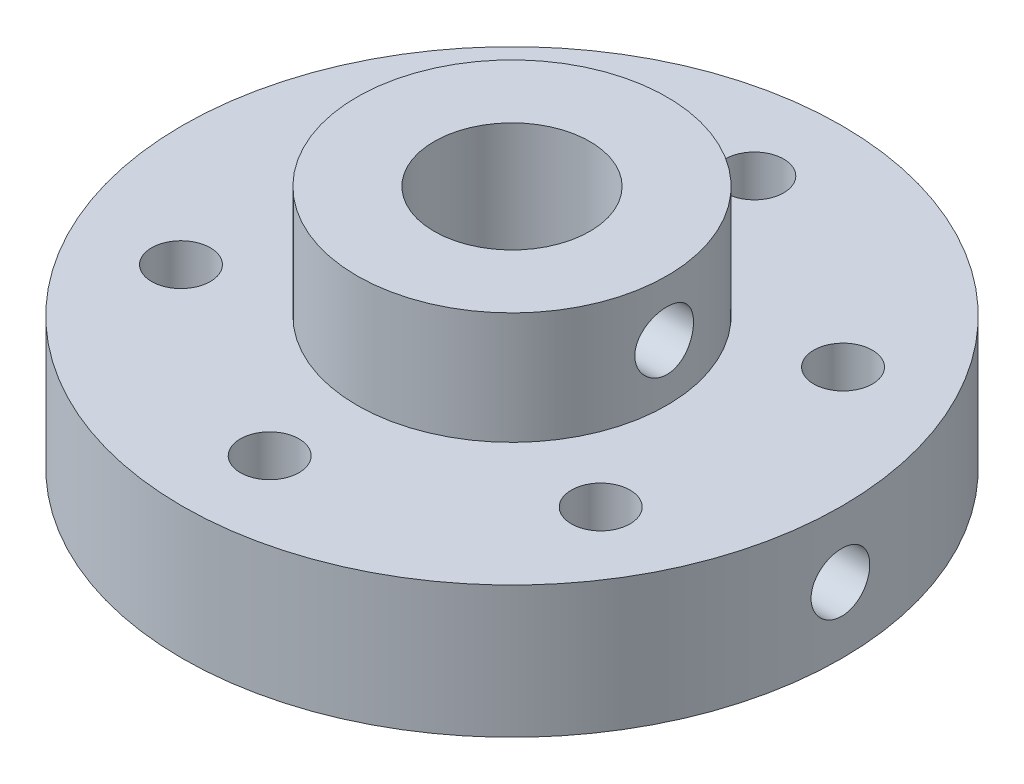
ISO-10303-21;
HEADER;
FILE_DESCRIPTION(('STEP AP214'),'2;1');
FILE_NAME('part.step','',(''),(''),'','','');
FILE_SCHEMA(('AUTOMOTIVE_DESIGN { 1 0 10303 214 1 1 1 1 }'));
ENDSEC;
DATA;
#1=APPLICATION_CONTEXT('core data for automotive mechanical design processes');
#2=APPLICATION_PROTOCOL_DEFINITION('international standard','automotive_design',2000,#1);
#3=PRODUCT_CONTEXT('',#1,'mechanical');
#4=PRODUCT('Part','Part','',(#3));
#5=PRODUCT_RELATED_PRODUCT_CATEGORY('part','',(#4));
#6=PRODUCT_DEFINITION_FORMATION('','',#4);
#7=PRODUCT_DEFINITION_CONTEXT('part definition',#1,'design');
#8=PRODUCT_DEFINITION('design','',#6,#7);
#9=PRODUCT_DEFINITION_SHAPE('','',#8);
#10=(LENGTH_UNIT() NAMED_UNIT(*) SI_UNIT(.MILLI.,.METRE.));
#11=(NAMED_UNIT(*) PLANE_ANGLE_UNIT() SI_UNIT($,.RADIAN.));
#12=(NAMED_UNIT(*) SI_UNIT($,.STERADIAN.) SOLID_ANGLE_UNIT());
#13=UNCERTAINTY_MEASURE_WITH_UNIT(LENGTH_MEASURE(1.E-05),#10,'distance_accuracy_value','');
#14=(GEOMETRIC_REPRESENTATION_CONTEXT(3) GLOBAL_UNCERTAINTY_ASSIGNED_CONTEXT((#13)) GLOBAL_UNIT_ASSIGNED_CONTEXT((#10,
#11,#12)) REPRESENTATION_CONTEXT('',''));
#15=CARTESIAN_POINT('',(0.,0.,0.));
#16=DIRECTION('',(0.,0.,1.));
#17=DIRECTION('',(1.,0.,0.));
#18=AXIS2_PLACEMENT_3D('',#15,#16,#17);
#19=CARTESIAN_POINT('',(0.,5.08,0.));
#20=DIRECTION('',(0.,1.,0.));
#21=DIRECTION('',(0.,0.,1.));
#22=AXIS2_PLACEMENT_3D('',#19,#20,#21);
#23=PLANE('',#22);
#24=CARTESIAN_POINT('',(8.08391413162611,5.08,-4.66724999999953));
#25=DIRECTION('',(0.,1.,0.));
#26=DIRECTION('',(0.,0.,1.));
#27=AXIS2_PLACEMENT_3D('',#24,#25,#26);
#28=CIRCLE('',#27,1.13029999999999);
#29=CARTESIAN_POINT('',(8.08391413162611,5.08,-3.53694999999954));
#30=VERTEX_POINT('',#29);
#31=EDGE_CURVE('E79',#30,#30,#28,.T.);
#32=ORIENTED_EDGE('',*,*,#31,.F.);
#33=EDGE_LOOP('',(#32));
#34=FACE_BOUND('',#33,.T.);
#35=CARTESIAN_POINT('',(8.08391413162562,5.08,4.66725000000038));
#36=DIRECTION('',(0.,1.,0.));
#37=DIRECTION('',(0.,0.,1.));
#38=AXIS2_PLACEMENT_3D('',#35,#36,#37);
#39=CIRCLE('',#38,1.13029999999999);
#40=CARTESIAN_POINT('',(8.08391413162562,5.08,5.79755000000036));
#41=VERTEX_POINT('',#40);
#42=EDGE_CURVE('E87',#41,#41,#39,.T.);
#43=ORIENTED_EDGE('',*,*,#42,.F.);
#44=EDGE_LOOP('',(#43));
#45=FACE_BOUND('',#44,.T.);
#46=CARTESIAN_POINT('',(0.,5.08,9.3345));
#47=DIRECTION('',(0.,1.,0.));
#48=DIRECTION('',(0.,0.,1.));
#49=AXIS2_PLACEMENT_3D('',#46,#47,#48);
#50=CIRCLE('',#49,1.13029999999999);
#51=CARTESIAN_POINT('',(0.,5.08,10.4648));
#52=VERTEX_POINT('',#51);
#53=EDGE_CURVE('E93',#52,#52,#50,.T.);
#54=ORIENTED_EDGE('',*,*,#53,.F.);
#55=EDGE_LOOP('',(#54));
#56=FACE_BOUND('',#55,.T.);
#57=CARTESIAN_POINT('',(-8.08391413162595,5.08,4.66724999999981));
#58=DIRECTION('',(0.,1.,0.));
#59=DIRECTION('',(0.,0.,1.));
#60=AXIS2_PLACEMENT_3D('',#57,#58,#59);
#61=CIRCLE('',#60,1.13029999999999);
#62=CARTESIAN_POINT('',(-8.08391413162595,5.08,5.7975499999998));
#63=VERTEX_POINT('',#62);
#64=EDGE_CURVE('E99',#63,#63,#61,.T.);
#65=ORIENTED_EDGE('',*,*,#64,.F.);
#66=EDGE_LOOP('',(#65));
#67=FACE_BOUND('',#66,.T.);
#68=CARTESIAN_POINT('',(-8.08391413162579,5.08,-4.66725000000009));
#69=DIRECTION('',(0.,1.,0.));
#70=DIRECTION('',(0.,0.,1.));
#71=AXIS2_PLACEMENT_3D('',#68,#69,#70);
#72=CIRCLE('',#71,1.13029999999999);
#73=CARTESIAN_POINT('',(-8.08391413162579,5.08,-3.53695000000011));
#74=VERTEX_POINT('',#73);
#75=EDGE_CURVE('E105',#74,#74,#72,.T.);
#76=ORIENTED_EDGE('',*,*,#75,.F.);
#77=EDGE_LOOP('',(#76));
#78=FACE_BOUND('',#77,.T.);
#79=CARTESIAN_POINT('',(0.,5.08,-9.3345));
#80=DIRECTION('',(0.,1.,0.));
#81=DIRECTION('',(0.,0.,1.));
#82=AXIS2_PLACEMENT_3D('',#79,#80,#81);
#83=CIRCLE('',#82,1.13029999999999);
#84=CARTESIAN_POINT('',(0.,5.08,-8.20420000000001));
#85=VERTEX_POINT('',#84);
#86=EDGE_CURVE('E111',#85,#85,#83,.T.);
#87=ORIENTED_EDGE('',*,*,#86,.F.);
#88=EDGE_LOOP('',(#87));
#89=FACE_BOUND('',#88,.T.);
#90=CARTESIAN_POINT('',(0.,5.08,0.));
#91=DIRECTION('',(0.,1.,0.));
#92=DIRECTION('',(0.,0.,1.));
#93=AXIS2_PLACEMENT_3D('',#90,#91,#92);
#94=CIRCLE('',#93,12.7);
#95=CARTESIAN_POINT('',(0.,5.08,12.7));
#96=VERTEX_POINT('',#95);
#97=EDGE_CURVE('E44',#96,#96,#94,.T.);
#98=ORIENTED_EDGE('',*,*,#97,.T.);
#99=EDGE_LOOP('',(#98));
#100=FACE_BOUND('',#99,.T.);
#101=CARTESIAN_POINT('',(0.,5.08,0.));
#102=DIRECTION('',(0.,1.,0.));
#103=DIRECTION('',(0.,0.,1.));
#104=AXIS2_PLACEMENT_3D('',#101,#102,#103);
#105=CIRCLE('',#104,5.969);
#106=CARTESIAN_POINT('',(0.,5.08,5.969));
#107=VERTEX_POINT('',#106);
#108=EDGE_CURVE('E117',#107,#107,#105,.T.);
#109=ORIENTED_EDGE('',*,*,#108,.F.);
#110=EDGE_LOOP('',(#109));
#111=FACE_BOUND('',#110,.T.);
#112=ADVANCED_FACE('F31',(#34,#45,#56,#67,#78,#89,#100,#111),#23,.T.);
#113=CARTESIAN_POINT('',(0.,5.08,0.));
#114=DIRECTION('',(0.,-1.,0.));
#115=DIRECTION('',(0.,0.,-1.));
#116=AXIS2_PLACEMENT_3D('',#113,#114,#115);
#117=CYLINDRICAL_SURFACE('',#116,12.7);
#118=CARTESIAN_POINT('',(12.7,1.40970000000001,0.));
#119=CARTESIAN_POINT('',(12.6999993442662,1.40970275996524,0.0633549662870578));
#120=CARTESIAN_POINT('',(12.6995208743728,1.41504463045691,0.126752665207346));
#121=CARTESIAN_POINT('',(12.6976581682521,1.43627511603167,0.251792843437398));
#122=CARTESIAN_POINT('',(12.6962729149133,1.4521755746525,0.313433270551566));
#123=CARTESIAN_POINT('',(12.6927531279238,1.49405879468067,0.433129919396754));
#124=CARTESIAN_POINT('',(12.6906190274599,1.52003572804752,0.491188190521169));
#125=CARTESIAN_POINT('',(12.68584065064,1.58132379024321,0.60210692242587));
#126=CARTESIAN_POINT('',(12.6831964809823,1.61663296748805,0.65496846679239));
#127=CARTESIAN_POINT('',(12.6776859812866,1.6956929641805,0.754159197131341));
#128=CARTESIAN_POINT('',(12.6748190997262,1.73946516761339,0.800471309893539));
#129=CARTESIAN_POINT('',(12.6691908973995,1.8341633345258,0.885101966605944));
#130=CARTESIAN_POINT('',(12.6664295813516,1.88508961729169,0.923420153597666));
#131=CARTESIAN_POINT('',(12.6613193372878,1.99275496911822,0.991034006795327));
#132=CARTESIAN_POINT('',(12.6589711052144,2.04950359752639,1.02031450821889));
#133=CARTESIAN_POINT('',(12.6549594154604,2.1671362454533,1.06892497046169));
#134=CARTESIAN_POINT('',(12.6532959441501,2.22802018263292,1.08825512933881));
#135=CARTESIAN_POINT('',(12.6508468875705,2.35202297237841,1.11636627626064));
#136=CARTESIAN_POINT('',(12.65005897243,2.4151354302412,1.12517526603385));
#137=CARTESIAN_POINT('',(12.6494429242787,2.54194763005314,1.13208054267278));
#138=CARTESIAN_POINT('',(12.6496147709531,2.60564735954326,1.13017705628481));
#139=CARTESIAN_POINT('',(12.6508967086965,2.73163364643223,1.11573453505945));
#140=CARTESIAN_POINT('',(12.6520041110958,2.79392372880229,1.10322597749987));
#141=CARTESIAN_POINT('',(12.6550281729631,2.91551680096642,1.06797575874834));
#142=CARTESIAN_POINT('',(12.6569448413074,2.97481975798859,1.04523398531445));
#143=CARTESIAN_POINT('',(12.661374570342,3.0888520409167,0.990128920983867));
#144=CARTESIAN_POINT('',(12.6638884745654,3.14357474850884,0.957752004966511));
#145=CARTESIAN_POINT('',(12.6692286657572,3.24682076504201,0.884305528900144));
#146=CARTESIAN_POINT('',(12.6720549599532,3.29534393049405,0.843235767712834));
#147=CARTESIAN_POINT('',(12.6777134478915,3.38499064342493,0.753398711268004));
#148=CARTESIAN_POINT('',(12.6805456278451,3.42608780111357,0.704605076649213));
#149=CARTESIAN_POINT('',(12.6858874119665,3.49951170078229,0.600797098391809));
#150=CARTESIAN_POINT('',(12.6883970158769,3.53183843575969,0.545782749786351));
#151=CARTESIAN_POINT('',(12.692811467624,3.58680239672926,0.431077483891174));
#152=CARTESIAN_POINT('',(12.6947162391092,3.60943839952807,0.371385977360789));
#153=CARTESIAN_POINT('',(12.6977055702252,3.64435959074977,0.249028930160306));
#154=CARTESIAN_POINT('',(12.698790149275,3.65664502423433,0.186363459939339));
#155=CARTESIAN_POINT('',(12.7000144007699,3.6704831265007,0.0600660041406285));
#156=CARTESIAN_POINT('',(12.7001572813243,3.6720722351296,-0.0035619590367424));
#157=CARTESIAN_POINT('',(12.6994906162937,3.66456811790858,-0.130179123062571));
#158=CARTESIAN_POINT('',(12.6986810808622,3.65547500593908,-0.193168330713417));
#159=CARTESIAN_POINT('',(12.6962026618106,3.62689477944628,-0.316615641736333));
#160=CARTESIAN_POINT('',(12.6945351793369,3.60742461024132,-0.377077698751924));
#161=CARTESIAN_POINT('',(12.6905281036814,3.55866029739495,-0.493877017716605));
#162=CARTESIAN_POINT('',(12.6881884984357,3.52936597741896,-0.550214205605931));
#163=CARTESIAN_POINT('',(12.6830912656799,3.46169373241325,-0.657330068574677));
#164=CARTESIAN_POINT('',(12.6803325372428,3.42329173027503,-0.708093479326384));
#165=CARTESIAN_POINT('',(12.6747105175415,3.33852891040848,-0.802466579915461));
#166=CARTESIAN_POINT('',(12.6718472242049,3.29216793488274,-0.846076127884289));
#167=CARTESIAN_POINT('',(12.6663292375558,3.19264477851914,-0.925029072785663));
#168=CARTESIAN_POINT('',(12.6636751596436,3.13946365961629,-0.960348646577449));
#169=CARTESIAN_POINT('',(12.6588850522987,3.0279038233009,-1.02155556833741));
#170=CARTESIAN_POINT('',(12.6567490170742,2.96952516400875,-1.0474430217618));
#171=CARTESIAN_POINT('',(12.6532404409206,2.8493109072017,-1.08901049476346));
#172=CARTESIAN_POINT('',(12.6518668193799,2.78748033987342,-1.10470496682232));
#173=CARTESIAN_POINT('',(12.6500350747212,2.66204883559887,-1.12548797292162));
#174=CARTESIAN_POINT('',(12.649576931264,2.59844793801565,-1.1305767425878));
#175=CARTESIAN_POINT('',(12.6496283581756,2.47151792687397,-1.13000099869347));
#176=CARTESIAN_POINT('',(12.6501345603107,2.40818863882937,-1.12437391313382));
#177=CARTESIAN_POINT('',(12.6520504780416,2.28337852391187,-1.10260437390431));
#178=CARTESIAN_POINT('',(12.6534601949107,2.2218976996441,-1.08646190541541));
#179=CARTESIAN_POINT('',(12.6570234016182,2.10252818113132,-1.04412958765887));
#180=CARTESIAN_POINT('',(12.6591768311197,2.04463919593201,-1.01794055344363));
#181=CARTESIAN_POINT('',(12.6639849385614,1.93407320902907,-0.956262575165948));
#182=CARTESIAN_POINT('',(12.6666396102607,1.88139614244489,-0.920773746892058));
#183=CARTESIAN_POINT('',(12.6721621485101,1.7825576054641,-0.841362858948852));
#184=CARTESIAN_POINT('',(12.6750306980048,1.73641850195347,-0.797413007717867));
#185=CARTESIAN_POINT('',(12.6806515272886,1.65215208116953,-0.702379940550796));
#186=CARTESIAN_POINT('',(12.6834037788713,1.61402669870939,-0.651295006881941));
#187=CARTESIAN_POINT('',(12.6884875727796,1.54681120811584,-0.543330140990367));
#188=CARTESIAN_POINT('',(12.6908182332511,1.51773994919049,-0.486438442445036));
#189=CARTESIAN_POINT('',(12.6947861884187,1.46960045235025,-0.368598504243941));
#190=CARTESIAN_POINT('',(12.6964242748527,1.45052078624174,-0.307654989327821));
#191=CARTESIAN_POINT('',(12.6984048358795,1.4277328905001,-0.205297080416445));
#192=CARTESIAN_POINT('',(12.6990002781437,1.42097962458262,-0.164539754289082));
#193=CARTESIAN_POINT('',(12.6997980731845,1.41196228730164,-0.0825276628943301));
#194=CARTESIAN_POINT('',(12.7000004271809,1.40969820200731,-0.0412728991709899));
#195=CARTESIAN_POINT('',(12.7,1.40970000000001,0.));
#196=B_SPLINE_CURVE_WITH_KNOTS('',3,(#118,#119,#120,#121,#122,#123,#124,#125,#126,#127,#128,
#129,#130,#131,#132,#133,#134,#135,#136,#137,#138,#139,#140,#141,#142,#143,#144,#145,#146,#147,
#148,#149,#150,#151,#152,#153,#154,#155,#156,#157,#158,#159,#160,#161,#162,#163,#164,#165,#166,
#167,#168,#169,#170,#171,#172,#173,#174,#175,#176,#177,#178,#179,#180,#181,#182,#183,#184,#185,
#186,#187,#188,#189,#190,#191,#192,#193,#194,#195),.UNSPECIFIED.,.T.,.F.,(4,2,2,2,2,2,2,2,2,2,2,
2,2,2,2,2,2,2,2,2,2,2,2,2,2,2,2,2,2,2,2,2,2,2,2,2,2,2,4),(0.,0.189914200719066,
0.380041788304177,0.570059573297018,0.760037652656218,0.950502185906145,1.14097522228554,
1.33176614687074,1.52255327368612,1.71283148752738,1.90310567384789,2.09283488891787,
2.28256618506335,2.47256706685702,2.66257234544273,2.85324010665162,3.0439080200977,
3.23459999313065,3.42528745118416,3.6153249519465,3.80536042678587,3.99508652784743,
4.18481603450222,4.37505281433224,4.56529336629959,4.75607410165669,4.94685270391613,
5.13736020994908,5.32786348345201,5.51770259330726,5.70754197069814,5.89736595015787,
6.08718756629667,6.27764366067293,6.46814568561706,6.65904169388162,6.84971887938924,
6.97343978780015,7.09716031227967),.UNSPECIFIED.);
#197=CARTESIAN_POINT('',(12.7,1.40970000000001,0.));
#198=VERTEX_POINT('',#197);
#199=EDGE_CURVE('E10',#198,#198,#196,.T.);
#200=ORIENTED_EDGE('',*,*,#199,.T.);
#201=EDGE_LOOP('',(#200));
#202=FACE_BOUND('',#201,.T.);
#203=ORIENTED_EDGE('',*,*,#97,.F.);
#204=EDGE_LOOP('',(#203));
#205=FACE_BOUND('',#204,.T.);
#206=CARTESIAN_POINT('',(0.,0.,0.));
#207=DIRECTION('',(0.,1.,0.));
#208=DIRECTION('',(0.,0.,1.));
#209=AXIS2_PLACEMENT_3D('',#206,#207,#208);
#210=CIRCLE('',#209,12.7);
#211=CARTESIAN_POINT('',(0.,0.,12.7));
#212=VERTEX_POINT('',#211);
#213=EDGE_CURVE('E48',#212,#212,#210,.T.);
#214=ORIENTED_EDGE('',*,*,#213,.T.);
#215=EDGE_LOOP('',(#214));
#216=FACE_BOUND('',#215,.T.);
#217=ADVANCED_FACE('F33',(#202,#205,#216),#117,.T.);
#218=CARTESIAN_POINT('',(0.,0.,0.));
#219=DIRECTION('',(0.,1.,0.));
#220=DIRECTION('',(0.,0.,1.));
#221=AXIS2_PLACEMENT_3D('',#218,#219,#220);
#222=PLANE('',#221);
#223=CARTESIAN_POINT('',(0.,0.,0.));
#224=DIRECTION('',(0.,1.,0.));
#225=DIRECTION('',(0.,0.,1.));
#226=AXIS2_PLACEMENT_3D('',#223,#224,#225);
#227=CIRCLE('',#226,3.);
#228=CARTESIAN_POINT('',(0.,0.,3.));
#229=VERTEX_POINT('',#228);
#230=EDGE_CURVE('E76',#229,#229,#227,.T.);
#231=ORIENTED_EDGE('',*,*,#230,.T.);
#232=EDGE_LOOP('',(#231));
#233=FACE_BOUND('',#232,.T.);
#234=CARTESIAN_POINT('',(8.08391413162611,0.,-4.66724999999953));
#235=DIRECTION('',(0.,1.,0.));
#236=DIRECTION('',(0.,0.,1.));
#237=AXIS2_PLACEMENT_3D('',#234,#235,#236);
#238=CIRCLE('',#237,1.1303);
#239=CARTESIAN_POINT('',(8.08391413162611,0.,-3.53694999999953));
#240=VERTEX_POINT('',#239);
#241=EDGE_CURVE('E84',#240,#240,#238,.T.);
#242=ORIENTED_EDGE('',*,*,#241,.T.);
#243=EDGE_LOOP('',(#242));
#244=FACE_BOUND('',#243,.T.);
#245=CARTESIAN_POINT('',(8.08391413162562,0.,4.66725000000038));
#246=DIRECTION('',(0.,1.,0.));
#247=DIRECTION('',(0.,0.,1.));
#248=AXIS2_PLACEMENT_3D('',#245,#246,#247);
#249=CIRCLE('',#248,1.1303);
#250=CARTESIAN_POINT('',(8.08391413162562,0.,5.79755000000037));
#251=VERTEX_POINT('',#250);
#252=EDGE_CURVE('E90',#251,#251,#249,.T.);
#253=ORIENTED_EDGE('',*,*,#252,.T.);
#254=EDGE_LOOP('',(#253));
#255=FACE_BOUND('',#254,.T.);
#256=CARTESIAN_POINT('',(0.,0.,9.3345));
#257=DIRECTION('',(0.,1.,0.));
#258=DIRECTION('',(0.,0.,1.));
#259=AXIS2_PLACEMENT_3D('',#256,#257,#258);
#260=CIRCLE('',#259,1.1303);
#261=CARTESIAN_POINT('',(0.,0.,10.4648));
#262=VERTEX_POINT('',#261);
#263=EDGE_CURVE('E96',#262,#262,#260,.T.);
#264=ORIENTED_EDGE('',*,*,#263,.T.);
#265=EDGE_LOOP('',(#264));
#266=FACE_BOUND('',#265,.T.);
#267=CARTESIAN_POINT('',(-8.08391413162595,0.,4.66724999999981));
#268=DIRECTION('',(0.,1.,0.));
#269=DIRECTION('',(0.,0.,1.));
#270=AXIS2_PLACEMENT_3D('',#267,#268,#269);
#271=CIRCLE('',#270,1.1303);
#272=CARTESIAN_POINT('',(-8.08391413162595,0.,5.79754999999981));
#273=VERTEX_POINT('',#272);
#274=EDGE_CURVE('E102',#273,#273,#271,.T.);
#275=ORIENTED_EDGE('',*,*,#274,.T.);
#276=EDGE_LOOP('',(#275));
#277=FACE_BOUND('',#276,.T.);
#278=CARTESIAN_POINT('',(-8.08391413162579,0.,-4.66725000000009));
#279=DIRECTION('',(0.,1.,0.));
#280=DIRECTION('',(0.,0.,1.));
#281=AXIS2_PLACEMENT_3D('',#278,#279,#280);
#282=CIRCLE('',#281,1.1303);
#283=CARTESIAN_POINT('',(-8.08391413162579,0.,-3.5369500000001));
#284=VERTEX_POINT('',#283);
#285=EDGE_CURVE('E108',#284,#284,#282,.T.);
#286=ORIENTED_EDGE('',*,*,#285,.T.);
#287=EDGE_LOOP('',(#286));
#288=FACE_BOUND('',#287,.T.);
#289=CARTESIAN_POINT('',(0.,0.,-9.3345));
#290=DIRECTION('',(0.,1.,0.));
#291=DIRECTION('',(0.,0.,1.));
#292=AXIS2_PLACEMENT_3D('',#289,#290,#291);
#293=CIRCLE('',#292,1.1303);
#294=CARTESIAN_POINT('',(0.,0.,-8.2042));
#295=VERTEX_POINT('',#294);
#296=EDGE_CURVE('E114',#295,#295,#293,.T.);
#297=ORIENTED_EDGE('',*,*,#296,.T.);
#298=EDGE_LOOP('',(#297));
#299=FACE_BOUND('',#298,.T.);
#300=ORIENTED_EDGE('',*,*,#213,.F.);
#301=EDGE_LOOP('',(#300));
#302=FACE_BOUND('',#301,.T.);
#303=ADVANCED_FACE('F132',(#233,#244,#255,#266,#277,#288,#299,#302),#222,.F.);
#304=CARTESIAN_POINT('',(0.,9.398,0.));
#305=DIRECTION('',(0.,-1.,0.));
#306=DIRECTION('',(0.,0.,-1.));
#307=AXIS2_PLACEMENT_3D('',#304,#305,#306);
#308=CYLINDRICAL_SURFACE('',#307,5.969);
#309=CARTESIAN_POINT('',(5.86100528151955,7.239,1.13029999999999));
#310=CARTESIAN_POINT('',(5.86100650436501,7.30187571900063,1.1302976003409));
#311=CARTESIAN_POINT('',(5.86202804906502,7.36478243698824,1.12503577241428));
#312=CARTESIAN_POINT('',(5.86599862931337,7.48882121699831,1.10414216215463));
#313=CARTESIAN_POINT('',(5.86894928645487,7.54995174077694,1.08850165543937));
#314=CARTESIAN_POINT('',(5.87643220001691,7.66862548146637,1.04734893457459));
#315=CARTESIAN_POINT('',(5.88096296830454,7.72617201385426,1.02184600630373));
#316=CARTESIAN_POINT('',(5.89109383698376,7.83616639532587,0.961717094339618));
#317=CARTESIAN_POINT('',(5.89669385738841,7.88861462535288,0.927091792985133));
#318=CARTESIAN_POINT('',(5.90841163451667,7.98759295391688,0.849232621605356));
#319=CARTESIAN_POINT('',(5.9145345556804,8.03404895141397,0.805905313716487));
#320=CARTESIAN_POINT('',(5.92656264492508,8.11907828936841,0.712073963886459));
#321=CARTESIAN_POINT('',(5.93246779855132,8.15765110733417,0.661569446620781));
#322=CARTESIAN_POINT('',(5.94345038029217,8.22610361961992,0.554330020035793));
#323=CARTESIAN_POINT('',(5.94852101337873,8.25591336796895,0.49754970769247));
#324=CARTESIAN_POINT('',(5.95720539372565,8.30554280851488,0.379674733840938));
#325=CARTESIAN_POINT('',(5.96081926315668,8.32536333848679,0.318580434627997));
#326=CARTESIAN_POINT('',(5.96614645264733,8.35422234840947,0.194579773510154));
#327=CARTESIAN_POINT('',(5.96788178048805,8.36338577683313,0.131703452318075));
#328=CARTESIAN_POINT('',(5.969332239736,8.37105986276203,0.00528353856823607));
#329=CARTESIAN_POINT('',(5.96904754645549,8.36957144471273,-0.0582599956059422));
#330=CARTESIAN_POINT('',(5.96650721806362,8.35607976171222,-0.183353435642616));
#331=CARTESIAN_POINT('',(5.96427680368735,8.34421104278794,-0.244918438918429));
#332=CARTESIAN_POINT('',(5.95812395435357,8.31050855209156,-0.365166936504031));
#333=CARTESIAN_POINT('',(5.9542014568286,8.28867441183037,-0.423850324172101));
#334=CARTESIAN_POINT('',(5.9450631085227,8.23553318839899,-0.537059114137719));
#335=CARTESIAN_POINT('',(5.93983996674075,8.20417247658718,-0.591558730093646));
#336=CARTESIAN_POINT('',(5.92867768961266,8.1329078652577,-0.694572150783279));
#337=CARTESIAN_POINT('',(5.92273848008479,8.09300308027593,-0.743085334291668));
#338=CARTESIAN_POINT('',(5.91069203726392,8.00504213151339,-0.833546143427466));
#339=CARTESIAN_POINT('',(5.90458362884006,7.95686825170236,-0.875379229164185));
#340=CARTESIAN_POINT('',(5.89297592710915,7.85412831004553,-0.950389794115676));
#341=CARTESIAN_POINT('',(5.88747664307149,7.79956215095089,-0.983567141621744));
#342=CARTESIAN_POINT('',(5.87770804101646,7.68543288572386,-1.04035809575362));
#343=CARTESIAN_POINT('',(5.8734409029634,7.62586116095203,-1.06395478145403));
#344=CARTESIAN_POINT('',(5.86665289962141,7.50349960334539,-1.10077187911669));
#345=CARTESIAN_POINT('',(5.86413183220033,7.44071014391258,-1.11399349216251));
#346=CARTESIAN_POINT('',(5.86116147796436,7.31472910296386,-1.12951732387405));
#347=CARTESIAN_POINT('',(5.86068094833448,7.25155852954054,-1.13198422445343));
#348=CARTESIAN_POINT('',(5.86176243398808,7.12570816025938,-1.1263703004722));
#349=CARTESIAN_POINT('',(5.86332434612815,7.06302833977929,-1.11829000854538));
#350=CARTESIAN_POINT('',(5.86828560190545,6.94048188986047,-1.09195253200088));
#351=CARTESIAN_POINT('',(5.87166930747324,6.88059596421914,-1.07378192045647));
#352=CARTESIAN_POINT('',(5.87987938372223,6.76471862267201,-1.02787156261561));
#353=CARTESIAN_POINT('',(5.88470586257041,6.70872749915381,-1.00013109882813));
#354=CARTESIAN_POINT('',(5.89532867039687,6.60150435494534,-0.935490365928015));
#355=CARTESIAN_POINT('',(5.90113573789856,6.55033604883175,-0.898486208218591));
#356=CARTESIAN_POINT('',(5.91303531418564,6.4548754371228,-0.81650835533567));
#357=CARTESIAN_POINT('',(5.91912784913383,6.41058376337485,-0.77153392863995));
#358=CARTESIAN_POINT('',(5.93101242729256,6.32951712080145,-0.67415612920198));
#359=CARTESIAN_POINT('',(5.93679923434922,6.29285299380045,-0.621659740853617));
#360=CARTESIAN_POINT('',(5.94733181236497,6.22886504952777,-0.511156778289797));
#361=CARTESIAN_POINT('',(5.95207762395639,6.20154086767432,-0.453150419267264));
#362=CARTESIAN_POINT('',(5.95997099174372,6.15717374170455,-0.333578195725567));
#363=CARTESIAN_POINT('',(5.96312694358097,6.14007669890998,-0.272032983026317));
#364=CARTESIAN_POINT('',(5.96752084491334,6.11647669755988,-0.146879117386383));
#365=CARTESIAN_POINT('',(5.96875900043573,6.10997260100909,-0.0832706868451377));
#366=CARTESIAN_POINT('',(5.96917359333019,6.10778338732232,0.0431416495491047));
#367=CARTESIAN_POINT('',(5.96838191209802,6.11193097246693,0.10594261461985));
#368=CARTESIAN_POINT('',(5.96489214885801,6.13056054538665,0.229935616669108));
#369=CARTESIAN_POINT('',(5.96219408591821,6.14504242979584,0.291127669733963));
#370=CARTESIAN_POINT('',(5.95519483401151,6.183858447344,0.410075104901886));
#371=CARTESIAN_POINT('',(5.95089659826032,6.20817443813865,0.467836592016826));
#372=CARTESIAN_POINT('',(5.94116193041628,6.26594821835604,0.578484559586528));
#373=CARTESIAN_POINT('',(5.93572542004361,6.29940663655724,0.631370704400654));
#374=CARTESIAN_POINT('',(5.92421374203223,6.37508969709878,0.731599475589453));
#375=CARTESIAN_POINT('',(5.91813041858235,6.41743503627846,0.778850037154978));
#376=CARTESIAN_POINT('',(5.90606176925202,6.50943980676228,0.865632588954828));
#377=CARTESIAN_POINT('',(5.90007646677642,6.5591009573933,0.905162759686992));
#378=CARTESIAN_POINT('',(5.88881953922124,6.66489043558598,0.975734671291721));
#379=CARTESIAN_POINT('',(5.88355520807922,6.7210755446036,1.00669249676289));
#380=CARTESIAN_POINT('',(5.87442421447937,6.83793128160675,1.05868008896683));
#381=CARTESIAN_POINT('',(5.87055624094698,6.89859763721534,1.07971917435816));
#382=CARTESIAN_POINT('',(5.8654574564835,7.00603097029667,1.10702454805319));
#383=CARTESIAN_POINT('',(5.86379786809074,7.05217123630351,1.11573778865858));
#384=CARTESIAN_POINT('',(5.86157133987266,7.1452019312772,1.12737632812953));
#385=CARTESIAN_POINT('',(5.86100436923065,7.1920923390491,1.1303017902363));
#386=CARTESIAN_POINT('',(5.86100528151955,7.239,1.13029999999999));
#387=B_SPLINE_CURVE_WITH_KNOTS('',3,(#309,#310,#311,#312,#313,#314,#315,#316,#317,#318,#319,
#320,#321,#322,#323,#324,#325,#326,#327,#328,#329,#330,#331,#332,#333,#334,#335,#336,#337,#338,
#339,#340,#341,#342,#343,#344,#345,#346,#347,#348,#349,#350,#351,#352,#353,#354,#355,#356,#357,
#358,#359,#360,#361,#362,#363,#364,#365,#366,#367,#368,#369,#370,#371,#372,#373,#374,#375,#376,
#377,#378,#379,#380,#381,#382,#383,#384,#385,#386),.UNSPECIFIED.,.T.,.F.,(4,2,2,2,2,2,2,2,2,2,2,
2,2,2,2,2,2,2,2,2,2,2,2,2,2,2,2,2,2,2,2,2,2,2,2,2,2,2,4),(0.,0.188455484487355,
0.377069586852432,0.565506531906715,0.753929386181722,0.944495444040286,1.13507412838978,
1.32713507846872,1.51917991811271,1.70894968884639,1.89870299016573,2.08603262556271,
2.27336918836588,2.4617805213208,2.65021138972295,2.84158903191742,3.03296958601043,
3.22468669253471,3.41638160140669,3.60513062896728,3.79387012506065,3.98101474721277,
4.1681734034145,4.35753317137753,4.54691032804934,4.73887218485783,4.93082654764054,
5.12175633464518,5.31266560879876,5.50059481943755,5.68852215039373,5.87610435572855,
6.06369946544251,6.25402965795311,6.44440465252315,6.63658218645033,6.82857880795293,
6.96917768219907,7.1097725908725),.UNSPECIFIED.);
#388=CARTESIAN_POINT('',(5.86100528151955,7.239,1.13029999999999));
#389=VERTEX_POINT('',#388);
#390=EDGE_CURVE('E72',#389,#389,#387,.T.);
#391=ORIENTED_EDGE('',*,*,#390,.T.);
#392=EDGE_LOOP('',(#391));
#393=FACE_BOUND('',#392,.T.);
#394=CARTESIAN_POINT('',(0.,9.398,0.));
#395=DIRECTION('',(0.,1.,0.));
#396=DIRECTION('',(0.,0.,1.));
#397=AXIS2_PLACEMENT_3D('',#394,#395,#396);
#398=CIRCLE('',#397,5.969);
#399=CARTESIAN_POINT('',(0.,9.398,5.969));
#400=VERTEX_POINT('',#399);
#401=EDGE_CURVE('E118',#400,#400,#398,.T.);
#402=ORIENTED_EDGE('',*,*,#401,.F.);
#403=EDGE_LOOP('',(#402));
#404=FACE_BOUND('',#403,.T.);
#405=ORIENTED_EDGE('',*,*,#108,.T.);
#406=EDGE_LOOP('',(#405));
#407=FACE_BOUND('',#406,.T.);
#408=ADVANCED_FACE('F124',(#393,#404,#407),#308,.T.);
#409=CARTESIAN_POINT('',(0.,9.398,0.));
#410=DIRECTION('',(0.,1.,0.));
#411=DIRECTION('',(0.,0.,1.));
#412=AXIS2_PLACEMENT_3D('',#409,#410,#411);
#413=PLANE('',#412);
#414=CARTESIAN_POINT('',(0.,9.398,0.));
#415=DIRECTION('',(0.,1.,0.));
#416=DIRECTION('',(0.,0.,1.));
#417=AXIS2_PLACEMENT_3D('',#414,#415,#416);
#418=CIRCLE('',#417,3.);
#419=CARTESIAN_POINT('',(0.,9.398,3.));
#420=VERTEX_POINT('',#419);
#421=EDGE_CURVE('E71',#420,#420,#418,.T.);
#422=ORIENTED_EDGE('',*,*,#421,.F.);
#423=EDGE_LOOP('',(#422));
#424=FACE_BOUND('',#423,.T.);
#425=ORIENTED_EDGE('',*,*,#401,.T.);
#426=EDGE_LOOP('',(#425));
#427=FACE_BOUND('',#426,.T.);
#428=ADVANCED_FACE('F142',(#424,#427),#413,.T.);
#429=CARTESIAN_POINT('',(0.,5.08,-9.3345));
#430=DIRECTION('',(0.,1.,0.));
#431=DIRECTION('',(0.,0.,1.));
#432=AXIS2_PLACEMENT_3D('',#429,#430,#431);
#433=CYLINDRICAL_SURFACE('',#432,1.13029999999999);
#434=ORIENTED_EDGE('',*,*,#296,.F.);
#435=EDGE_LOOP('',(#434));
#436=FACE_BOUND('',#435,.T.);
#437=ORIENTED_EDGE('',*,*,#86,.T.);
#438=EDGE_LOOP('',(#437));
#439=FACE_BOUND('',#438,.T.);
#440=ADVANCED_FACE('F162',(#436,#439),#433,.F.);
#441=CARTESIAN_POINT('',(-8.08391413162579,5.08,-4.66725000000009));
#442=DIRECTION('',(0.,1.,0.));
#443=DIRECTION('',(0.,0.,1.));
#444=AXIS2_PLACEMENT_3D('',#441,#442,#443);
#445=CYLINDRICAL_SURFACE('',#444,1.13029999999999);
#446=ORIENTED_EDGE('',*,*,#285,.F.);
#447=EDGE_LOOP('',(#446));
#448=FACE_BOUND('',#447,.T.);
#449=ORIENTED_EDGE('',*,*,#75,.T.);
#450=EDGE_LOOP('',(#449));
#451=FACE_BOUND('',#450,.T.);
#452=ADVANCED_FACE('F165',(#448,#451),#445,.F.);
#453=CARTESIAN_POINT('',(-8.08391413162595,5.08,4.66724999999981));
#454=DIRECTION('',(0.,1.,0.));
#455=DIRECTION('',(0.,0.,1.));
#456=AXIS2_PLACEMENT_3D('',#453,#454,#455);
#457=CYLINDRICAL_SURFACE('',#456,1.13029999999999);
#458=ORIENTED_EDGE('',*,*,#274,.F.);
#459=EDGE_LOOP('',(#458));
#460=FACE_BOUND('',#459,.T.);
#461=ORIENTED_EDGE('',*,*,#64,.T.);
#462=EDGE_LOOP('',(#461));
#463=FACE_BOUND('',#462,.T.);
#464=ADVANCED_FACE('F176',(#460,#463),#457,.F.);
#465=CARTESIAN_POINT('',(0.,5.08,9.3345));
#466=DIRECTION('',(0.,1.,0.));
#467=DIRECTION('',(0.,0.,1.));
#468=AXIS2_PLACEMENT_3D('',#465,#466,#467);
#469=CYLINDRICAL_SURFACE('',#468,1.13029999999999);
#470=ORIENTED_EDGE('',*,*,#263,.F.);
#471=EDGE_LOOP('',(#470));
#472=FACE_BOUND('',#471,.T.);
#473=ORIENTED_EDGE('',*,*,#53,.T.);
#474=EDGE_LOOP('',(#473));
#475=FACE_BOUND('',#474,.T.);
#476=ADVANCED_FACE('F183',(#472,#475),#469,.F.);
#477=CARTESIAN_POINT('',(8.08391413162562,5.08,4.66725000000038));
#478=DIRECTION('',(0.,1.,0.));
#479=DIRECTION('',(0.,0.,1.));
#480=AXIS2_PLACEMENT_3D('',#477,#478,#479);
#481=CYLINDRICAL_SURFACE('',#480,1.13029999999999);
#482=ORIENTED_EDGE('',*,*,#252,.F.);
#483=EDGE_LOOP('',(#482));
#484=FACE_BOUND('',#483,.T.);
#485=ORIENTED_EDGE('',*,*,#42,.T.);
#486=EDGE_LOOP('',(#485));
#487=FACE_BOUND('',#486,.T.);
#488=ADVANCED_FACE('F187',(#484,#487),#481,.F.);
#489=CARTESIAN_POINT('',(8.08391413162611,5.08,-4.66724999999953));
#490=DIRECTION('',(0.,1.,0.));
#491=DIRECTION('',(0.,0.,1.));
#492=AXIS2_PLACEMENT_3D('',#489,#490,#491);
#493=CYLINDRICAL_SURFACE('',#492,1.13029999999999);
#494=ORIENTED_EDGE('',*,*,#241,.F.);
#495=EDGE_LOOP('',(#494));
#496=FACE_BOUND('',#495,.T.);
#497=ORIENTED_EDGE('',*,*,#31,.T.);
#498=EDGE_LOOP('',(#497));
#499=FACE_BOUND('',#498,.T.);
#500=ADVANCED_FACE('F190',(#496,#499),#493,.F.);
#501=CARTESIAN_POINT('',(0.,0.,0.));
#502=DIRECTION('',(0.,1.,0.));
#503=DIRECTION('',(0.,0.,1.));
#504=AXIS2_PLACEMENT_3D('',#501,#502,#503);
#505=CYLINDRICAL_SURFACE('',#504,3.);
#506=CARTESIAN_POINT('',(2.77892459595434,7.239,1.13029999999999));
#507=CARTESIAN_POINT('',(2.77892234710897,7.17798186336104,1.1303023973032));
#508=CARTESIAN_POINT('',(2.78095610514356,7.1169794371541,1.1253425870137));
#509=CARTESIAN_POINT('',(2.78881348017191,6.99681515617979,1.10572594215917));
#510=CARTESIAN_POINT('',(2.79463695567128,6.93765323278108,1.09106946963226));
#511=CARTESIAN_POINT('',(2.80932245580435,6.82293933242575,1.05267467093661));
#512=CARTESIAN_POINT('',(2.81817713288396,6.76737900906202,1.0289582897851));
#513=CARTESIAN_POINT('',(2.8379154449721,6.661004103047,0.973194738851497));
#514=CARTESIAN_POINT('',(2.84879969522836,6.61019096649445,0.941145041730977));
#515=CARTESIAN_POINT('',(2.87198269209467,6.51220279472791,0.867902086829478));
#516=CARTESIAN_POINT('',(2.8843233217585,6.4652995963514,0.826358314604322));
#517=CARTESIAN_POINT('',(2.90867937854485,6.37893400452852,0.736049991031225));
#518=CARTESIAN_POINT('',(2.92069473497549,6.33947321760327,0.687283884714618));
#519=CARTESIAN_POINT('',(2.94354489128358,6.26779958629918,0.581848341286065));
#520=CARTESIAN_POINT('',(2.95432487217062,6.23588271461252,0.524964761582408));
#521=CARTESIAN_POINT('',(2.97298573843443,6.18218441480754,0.406157642564596));
#522=CARTESIAN_POINT('',(2.98086763930208,6.16039943575122,0.344235877942969));
#523=CARTESIAN_POINT('',(2.99254690504711,6.12853818916533,0.219968356121656));
#524=CARTESIAN_POINT('',(2.99650703267903,6.11799381540946,0.1577582139999));
#525=CARTESIAN_POINT('',(3.00048096460213,6.10741270189635,0.0323337734503203));
#526=CARTESIAN_POINT('',(3.00049606423821,6.10737251310343,-0.0308801885565782));
#527=CARTESIAN_POINT('',(2.99668145715259,6.11752941637699,-0.153160645618167));
#528=CARTESIAN_POINT('',(2.99304369647791,6.12721542789416,-0.212276623933256));
#529=CARTESIAN_POINT('',(2.98258434178748,6.15568940076351,-0.327972900735555));
#530=CARTESIAN_POINT('',(2.97576252207645,6.17447800733747,-0.38455301916205));
#531=CARTESIAN_POINT('',(2.95948592548773,6.22085866285366,-0.494552549733516));
#532=CARTESIAN_POINT('',(2.9499941676736,6.24857521638818,-0.547913767009502));
#533=CARTESIAN_POINT('',(2.92933690747843,6.31191435335345,-0.649360684218573));
#534=CARTESIAN_POINT('',(2.91817086281451,6.34753950009252,-0.697444666142512));
#535=CARTESIAN_POINT('',(2.89453700609892,6.42814155684408,-0.789980920497176));
#536=CARTESIAN_POINT('',(2.88203125893023,6.47354626058582,-0.834051449830942));
#537=CARTESIAN_POINT('',(2.85765302458237,6.57117496944193,-0.914097379098933));
#538=CARTESIAN_POINT('',(2.8457807001455,6.62340071528355,-0.950070706226445));
#539=CARTESIAN_POINT('',(2.82377312860825,6.73470903438372,-1.01364010030523));
#540=CARTESIAN_POINT('',(2.81368318102528,6.7939198529379,-1.04102856572201));
#541=CARTESIAN_POINT('',(2.79690708147757,6.91659369665098,-1.08530088066929));
#542=CARTESIAN_POINT('',(2.79021901430001,6.98005430640903,-1.1021906420208));
#543=CARTESIAN_POINT('',(2.7814566481525,7.10565123452752,-1.12411361590822));
#544=CARTESIAN_POINT('',(2.77914650727625,7.16766501631563,-1.12975381861202));
#545=CARTESIAN_POINT('',(2.77873364946719,7.29178239562992,-1.13077005045422));
#546=CARTESIAN_POINT('',(2.78062986675614,7.35388596642157,-1.12614867959956));
#547=CARTESIAN_POINT('',(2.7881763743929,7.47328888629716,-1.10732346303563));
#548=CARTESIAN_POINT('',(2.79364171651671,7.53067563791479,-1.09359120146065));
#549=CARTESIAN_POINT('',(2.80749062309494,7.64230338586904,-1.05752862719366));
#550=CARTESIAN_POINT('',(2.81587478881687,7.69654373136914,-1.03519654286741));
#551=CARTESIAN_POINT('',(2.83500544859238,7.80261436390174,-0.981621099342705));
#552=CARTESIAN_POINT('',(2.84582910841221,7.85427661660802,-0.950073432213783));
#553=CARTESIAN_POINT('',(2.86849035669556,7.95178938800643,-0.879285212021892));
#554=CARTESIAN_POINT('',(2.8803283183623,7.99763775200961,-0.84004182048285));
#555=CARTESIAN_POINT('',(2.9046012707669,8.08527029482911,-0.752000013038108));
#556=CARTESIAN_POINT('',(2.91702589107108,8.12660557649041,-0.702750363406102));
#557=CARTESIAN_POINT('',(2.94034589776404,8.20047977380564,-0.597709450406739));
#558=CARTESIAN_POINT('',(2.95124127571072,8.23301864090038,-0.541918150929698));
#559=CARTESIAN_POINT('',(2.97027023595326,8.2881678253927,-0.425398489077821));
#560=CARTESIAN_POINT('',(2.97841273129867,8.31081025572753,-0.364686864476062));
#561=CARTESIAN_POINT('',(2.99104513402735,8.34543205440487,-0.239939303315381));
#562=CARTESIAN_POINT('',(2.99553677609473,8.35741648709515,-0.175904960933497));
#563=CARTESIAN_POINT('',(3.00019560782898,8.36983216347025,-0.0503851745928683));
#564=CARTESIAN_POINT('',(3.00060142915095,8.37090098774653,0.0110289025882864));
#565=CARTESIAN_POINT('',(2.99766663411477,8.36309815202944,0.133124632255487));
#566=CARTESIAN_POINT('',(2.99432647684277,8.35422771013702,0.193806373571384));
#567=CARTESIAN_POINT('',(2.9843845866184,8.32724649231127,0.311184683396696));
#568=CARTESIAN_POINT('',(2.97786583482154,8.30937044460837,0.367942773797199));
#569=CARTESIAN_POINT('',(2.962248644781,8.2651200490515,0.47765758733298));
#570=CARTESIAN_POINT('',(2.95314971809512,8.23874409198591,0.530613588329527));
#571=CARTESIAN_POINT('',(2.93280373902351,8.17697668157259,0.63367021011222));
#572=CARTESIAN_POINT('',(2.92148221916601,8.14125164577828,0.683555919931649));
#573=CARTESIAN_POINT('',(2.8980796557133,8.06232442454191,0.776820602561646));
#574=CARTESIAN_POINT('',(2.88599834098306,8.01911956014986,0.820197233676186));
#575=CARTESIAN_POINT('',(2.86164708057974,7.92371680451713,0.901597534130601));
#576=CARTESIAN_POINT('',(2.8494015105928,7.87116189491656,0.939211682513214));
#577=CARTESIAN_POINT('',(2.82683661899853,7.76009074925659,1.0050930000659));
#578=CARTESIAN_POINT('',(2.81651753258056,7.70157378668279,1.03335902832141));
#579=CARTESIAN_POINT('',(2.79872057245556,7.57718741396833,1.08066630658573));
#580=CARTESIAN_POINT('',(2.79140247006502,7.51110008303156,1.09920083270377));
#581=CARTESIAN_POINT('',(2.78150735319476,7.37633401258454,1.12401217793313));
#582=CARTESIAN_POINT('',(2.77892712633503,7.30765706115758,1.13029730257588));
#583=CARTESIAN_POINT('',(2.77892459595434,7.239,1.13029999999999));
#584=B_SPLINE_CURVE_WITH_KNOTS('',3,(#506,#507,#508,#509,#510,#511,#512,#513,#514,#515,#516,
#517,#518,#519,#520,#521,#522,#523,#524,#525,#526,#527,#528,#529,#530,#531,#532,#533,#534,#535,
#536,#537,#538,#539,#540,#541,#542,#543,#544,#545,#546,#547,#548,#549,#550,#551,#552,#553,#554,
#555,#556,#557,#558,#559,#560,#561,#562,#563,#564,#565,#566,#567,#568,#569,#570,#571,#572,#573,
#574,#575,#576,#577,#578,#579,#580,#581,#582,#583),.UNSPECIFIED.,.T.,.F.,(4,2,2,2,2,2,2,2,2,2,2,
2,2,2,2,2,2,2,2,2,2,2,2,2,2,2,2,2,2,2,2,2,2,2,2,2,2,2,4),(0.,0.182798687678896,
0.365590550704324,0.547942432096647,0.730349682032609,0.921080888922839,1.11185322010346,
1.30918710749725,1.50645178280519,1.69513544671701,1.88375715651127,2.06296037041626,
2.24217628869146,2.42400831025339,2.60589935290763,2.79852376321541,2.99119742760114,
3.18822362371483,3.38513877362037,3.57110586771532,3.7570258481236,3.9340035402058,
4.11101771066982,4.29470759898301,4.47846536698333,4.67400202026012,4.86953975294347,
5.06443818763898,5.25924396312405,5.44260114028835,5.62593584867887,5.80472173005677,
5.98354147926689,6.16991005225348,6.35634551298864,6.55273628625757,6.74915101968905,
6.95497407078191,7.16065751788149),.UNSPECIFIED.);
#585=CARTESIAN_POINT('',(2.77892459595434,7.239,1.13029999999999));
#586=VERTEX_POINT('',#585);
#587=EDGE_CURVE('E36',#586,#586,#584,.T.);
#588=ORIENTED_EDGE('',*,*,#587,.T.);
#589=EDGE_LOOP('',(#588));
#590=FACE_BOUND('',#589,.T.);
#591=CARTESIAN_POINT('',(2.77892459595435,2.54,1.13029999999999));
#592=CARTESIAN_POINT('',(2.77892234710897,2.47898186336104,1.1303023973032));
#593=CARTESIAN_POINT('',(2.78095610514356,2.4179794371541,1.1253425870137));
#594=CARTESIAN_POINT('',(2.78881348017192,2.29781515617979,1.10572594215917));
#595=CARTESIAN_POINT('',(2.79463695567128,2.23865323278108,1.09106946963226));
#596=CARTESIAN_POINT('',(2.80932245580435,2.12393933242575,1.05267467093661));
#597=CARTESIAN_POINT('',(2.81817713288396,2.06837900906202,1.0289582897851));
#598=CARTESIAN_POINT('',(2.8379154449721,1.962004103047,0.973194738851496));
#599=CARTESIAN_POINT('',(2.84879969522836,1.91119096649445,0.941145041730975));
#600=CARTESIAN_POINT('',(2.87198269209467,1.81320279472791,0.867902086829476));
#601=CARTESIAN_POINT('',(2.8843233217585,1.7662995963514,0.826358314604321));
#602=CARTESIAN_POINT('',(2.90867937854485,1.67993400452852,0.736049991031224));
#603=CARTESIAN_POINT('',(2.92069473497549,1.64047321760327,0.687283884714618));
#604=CARTESIAN_POINT('',(2.94354489128358,1.56879958629918,0.581848341286065));
#605=CARTESIAN_POINT('',(2.95432487217062,1.53688271461252,0.524964761582408));
#606=CARTESIAN_POINT('',(2.97298573843444,1.48318441480754,0.406157642564596));
#607=CARTESIAN_POINT('',(2.98086763930208,1.46139943575122,0.344235877942969));
#608=CARTESIAN_POINT('',(2.99254690504711,1.42953818916533,0.219968356121656));
#609=CARTESIAN_POINT('',(2.99650703267903,1.41899381540946,0.157758213999899));
#610=CARTESIAN_POINT('',(3.00048096460213,1.40841270189635,0.0323337734503201));
#611=CARTESIAN_POINT('',(3.00049606423821,1.40837251310343,-0.0308801885565782));
#612=CARTESIAN_POINT('',(2.99668145715259,1.41852941637699,-0.153160645618167));
#613=CARTESIAN_POINT('',(2.99304369647791,1.42821542789416,-0.212276623933256));
#614=CARTESIAN_POINT('',(2.98258434178748,1.45668940076351,-0.327972900735555));
#615=CARTESIAN_POINT('',(2.97576252207645,1.47547800733747,-0.38455301916205));
#616=CARTESIAN_POINT('',(2.95948592548773,1.52185866285366,-0.494552549733516));
#617=CARTESIAN_POINT('',(2.9499941676736,1.54957521638818,-0.547913767009502));
#618=CARTESIAN_POINT('',(2.92933690747843,1.61291435335345,-0.649360684218573));
#619=CARTESIAN_POINT('',(2.91817086281451,1.64853950009252,-0.697444666142512));
#620=CARTESIAN_POINT('',(2.89453700609892,1.72914155684408,-0.789980920497176));
#621=CARTESIAN_POINT('',(2.88203125893023,1.77454626058582,-0.834051449830942));
#622=CARTESIAN_POINT('',(2.85765302458237,1.87217496944193,-0.914097379098933));
#623=CARTESIAN_POINT('',(2.8457807001455,1.92440071528355,-0.950070706226444));
#624=CARTESIAN_POINT('',(2.82377312860825,2.03570903438372,-1.01364010030523));
#625=CARTESIAN_POINT('',(2.81368318102528,2.0949198529379,-1.04102856572201));
#626=CARTESIAN_POINT('',(2.79690708147757,2.21759369665098,-1.08530088066929));
#627=CARTESIAN_POINT('',(2.79021901430001,2.28105430640902,-1.1021906420208));
#628=CARTESIAN_POINT('',(2.7814566481525,2.40665123452752,-1.12411361590822));
#629=CARTESIAN_POINT('',(2.77914650727625,2.46866501631562,-1.12975381861202));
#630=CARTESIAN_POINT('',(2.77873364946719,2.59278239562992,-1.13077005045422));
#631=CARTESIAN_POINT('',(2.78062986675614,2.65488596642157,-1.12614867959956));
#632=CARTESIAN_POINT('',(2.7881763743929,2.77428888629716,-1.10732346303563));
#633=CARTESIAN_POINT('',(2.79364171651671,2.83167563791479,-1.09359120146065));
#634=CARTESIAN_POINT('',(2.80749062309494,2.94330338586904,-1.05752862719366));
#635=CARTESIAN_POINT('',(2.81587478881687,2.99754373136914,-1.03519654286741));
#636=CARTESIAN_POINT('',(2.83500544859238,3.10361436390174,-0.981621099342705));
#637=CARTESIAN_POINT('',(2.84582910841221,3.15527661660802,-0.950073432213783));
#638=CARTESIAN_POINT('',(2.86849035669556,3.25278938800643,-0.879285212021892));
#639=CARTESIAN_POINT('',(2.8803283183623,3.29863775200961,-0.84004182048285));
#640=CARTESIAN_POINT('',(2.9046012707669,3.38627029482911,-0.752000013038108));
#641=CARTESIAN_POINT('',(2.91702589107108,3.4276055764904,-0.702750363406102));
#642=CARTESIAN_POINT('',(2.94034589776404,3.50147977380563,-0.59770945040674));
#643=CARTESIAN_POINT('',(2.95124127571072,3.53401864090038,-0.541918150929698));
#644=CARTESIAN_POINT('',(2.97027023595326,3.58916782539269,-0.425398489077822));
#645=CARTESIAN_POINT('',(2.97841273129867,3.61181025572753,-0.364686864476063));
#646=CARTESIAN_POINT('',(2.99104513402735,3.64643205440487,-0.239939303315382));
#647=CARTESIAN_POINT('',(2.99553677609473,3.65841648709514,-0.175904960933498));
#648=CARTESIAN_POINT('',(3.00019560782898,3.67083216347025,-0.0503851745928691));
#649=CARTESIAN_POINT('',(3.00060142915095,3.67190098774652,0.0110289025882855));
#650=CARTESIAN_POINT('',(2.99766663411477,3.66409815202944,0.133124632255486));
#651=CARTESIAN_POINT('',(2.99432647684278,3.65522771013701,0.193806373571383));
#652=CARTESIAN_POINT('',(2.9843845866184,3.62824649231127,0.311184683396695));
#653=CARTESIAN_POINT('',(2.97786583482154,3.61037044460837,0.367942773797197));
#654=CARTESIAN_POINT('',(2.962248644781,3.5661200490515,0.477657587332978));
#655=CARTESIAN_POINT('',(2.95314971809512,3.5397440919859,0.530613588329526));
#656=CARTESIAN_POINT('',(2.93280373902351,3.47797668157259,0.633670210112219));
#657=CARTESIAN_POINT('',(2.92148221916601,3.44225164577828,0.683555919931647));
#658=CARTESIAN_POINT('',(2.8980796557133,3.36332442454191,0.776820602561645));
#659=CARTESIAN_POINT('',(2.88599834098306,3.32011956014986,0.820197233676185));
#660=CARTESIAN_POINT('',(2.86164708057974,3.22471680451712,0.9015975341306));
#661=CARTESIAN_POINT('',(2.8494015105928,3.17216189491656,0.939211682513213));
#662=CARTESIAN_POINT('',(2.82683661899853,3.06109074925659,1.0050930000659));
#663=CARTESIAN_POINT('',(2.81651753258056,3.00257378668279,1.0333590283214));
#664=CARTESIAN_POINT('',(2.79872057245556,2.87818741396833,1.08066630658573));
#665=CARTESIAN_POINT('',(2.79140247006502,2.81210008303156,1.09920083270377));
#666=CARTESIAN_POINT('',(2.78150735319476,2.67733401258454,1.12401217793312));
#667=CARTESIAN_POINT('',(2.77892712633503,2.60865706115758,1.13029730257588));
#668=CARTESIAN_POINT('',(2.77892459595435,2.54,1.13029999999999));
#669=B_SPLINE_CURVE_WITH_KNOTS('',3,(#591,#592,#593,#594,#595,#596,#597,#598,#599,#600,#601,
#602,#603,#604,#605,#606,#607,#608,#609,#610,#611,#612,#613,#614,#615,#616,#617,#618,#619,#620,
#621,#622,#623,#624,#625,#626,#627,#628,#629,#630,#631,#632,#633,#634,#635,#636,#637,#638,#639,
#640,#641,#642,#643,#644,#645,#646,#647,#648,#649,#650,#651,#652,#653,#654,#655,#656,#657,#658,
#659,#660,#661,#662,#663,#664,#665,#666,#667,#668),.UNSPECIFIED.,.T.,.F.,(4,2,2,2,2,2,2,2,2,2,2,
2,2,2,2,2,2,2,2,2,2,2,2,2,2,2,2,2,2,2,2,2,2,2,2,2,2,2,4),(0.,0.182798687678895,
0.365590550704323,0.547942432096645,0.730349682032609,0.921080888922838,1.11185322010346,
1.30918710749724,1.50645178280519,1.695135446717,1.88375715651126,2.06296037041626,
2.24217628869145,2.42400831025339,2.60589935290763,2.79852376321541,2.99119742760114,
3.18822362371482,3.38513877362036,3.57110586771532,3.7570258481236,3.9340035402058,
4.11101771066982,4.29470759898301,4.47846536698332,4.67400202026012,4.86953975294346,
5.06443818763898,5.25924396312405,5.44260114028835,5.62593584867887,5.80472173005677,
5.98354147926689,6.16991005225348,6.35634551298864,6.55273628625756,6.74915101968904,
6.95497407078191,7.16065751788148),.UNSPECIFIED.);
#670=CARTESIAN_POINT('',(2.77892459595435,2.54,1.13029999999999));
#671=VERTEX_POINT('',#670);
#672=EDGE_CURVE('E65',#671,#671,#669,.T.);
#673=ORIENTED_EDGE('',*,*,#672,.T.);
#674=EDGE_LOOP('',(#673));
#675=FACE_BOUND('',#674,.T.);
#676=ORIENTED_EDGE('',*,*,#230,.F.);
#677=EDGE_LOOP('',(#676));
#678=FACE_BOUND('',#677,.T.);
#679=ORIENTED_EDGE('',*,*,#421,.T.);
#680=EDGE_LOOP('',(#679));
#681=FACE_BOUND('',#680,.T.);
#682=ADVANCED_FACE('F58',(#590,#675,#678,#681),#505,.F.);
#683=CARTESIAN_POINT('',(0.,2.54,0.));
#684=DIRECTION('',(-1.,0.,0.));
#685=DIRECTION('',(0.,0.,1.));
#686=AXIS2_PLACEMENT_3D('',#683,#684,#685);
#687=CYLINDRICAL_SURFACE('',#686,1.13029999999999);
#688=ORIENTED_EDGE('',*,*,#199,.F.);
#689=EDGE_LOOP('',(#688));
#690=FACE_BOUND('',#689,.T.);
#691=ORIENTED_EDGE('',*,*,#672,.F.);
#692=EDGE_LOOP('',(#691));
#693=FACE_BOUND('',#692,.T.);
#694=ADVANCED_FACE('F54',(#690,#693),#687,.F.);
#695=CARTESIAN_POINT('',(0.,7.239,0.));
#696=DIRECTION('',(-1.,0.,0.));
#697=DIRECTION('',(0.,0.,1.));
#698=AXIS2_PLACEMENT_3D('',#695,#696,#697);
#699=CYLINDRICAL_SURFACE('',#698,1.13029999999999);
#700=ORIENTED_EDGE('',*,*,#587,.F.);
#701=EDGE_LOOP('',(#700));
#702=FACE_BOUND('',#701,.T.);
#703=ORIENTED_EDGE('',*,*,#390,.F.);
#704=EDGE_LOOP('',(#703));
#705=FACE_BOUND('',#704,.T.);
#706=ADVANCED_FACE('F57',(#702,#705),#699,.F.);
#707=CLOSED_SHELL('',(#112,#217,#303,#408,#428,#440,#452,#464,#476,#488,#500,#682,#694,#706));
#708=MANIFOLD_SOLID_BREP('B2',#707);
#709=ADVANCED_BREP_SHAPE_REPRESENTATION('',(#18,#708),#14);
#710=SHAPE_DEFINITION_REPRESENTATION(#9,#709);
ENDSEC;
END-ISO-10303-21;
